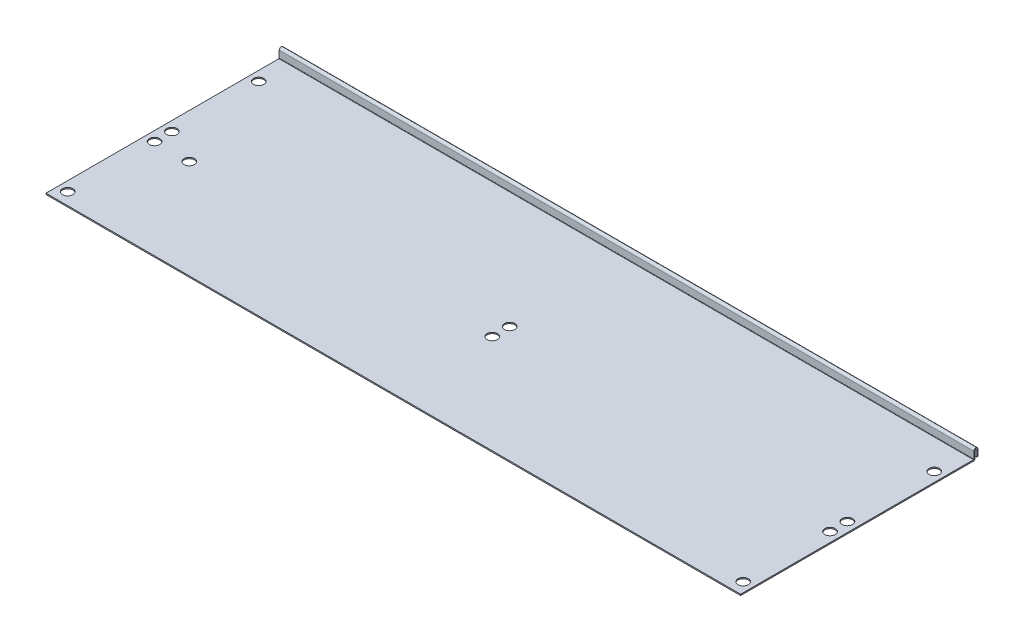
ISO-10303-21;
HEADER;
FILE_DESCRIPTION(('STEP AP214'),'2;1');
FILE_NAME('part.step','',(''),(''),'','','');
FILE_SCHEMA(('AUTOMOTIVE_DESIGN { 1 0 10303 214 1 1 1 1 }'));
ENDSEC;
DATA;
#1=APPLICATION_CONTEXT('core data for automotive mechanical design processes');
#2=APPLICATION_PROTOCOL_DEFINITION('international standard','automotive_design',2000,#1);
#3=PRODUCT_CONTEXT('',#1,'mechanical');
#4=PRODUCT('Part','Part','',(#3));
#5=PRODUCT_RELATED_PRODUCT_CATEGORY('part','',(#4));
#6=PRODUCT_DEFINITION_FORMATION('','',#4);
#7=PRODUCT_DEFINITION_CONTEXT('part definition',#1,'design');
#8=PRODUCT_DEFINITION('design','',#6,#7);
#9=PRODUCT_DEFINITION_SHAPE('','',#8);
#10=(LENGTH_UNIT() NAMED_UNIT(*) SI_UNIT(.MILLI.,.METRE.));
#11=(NAMED_UNIT(*) PLANE_ANGLE_UNIT() SI_UNIT($,.RADIAN.));
#12=(NAMED_UNIT(*) SI_UNIT($,.STERADIAN.) SOLID_ANGLE_UNIT());
#13=UNCERTAINTY_MEASURE_WITH_UNIT(LENGTH_MEASURE(1.E-05),#10,'distance_accuracy_value','');
#14=(GEOMETRIC_REPRESENTATION_CONTEXT(3) GLOBAL_UNCERTAINTY_ASSIGNED_CONTEXT((#13)) GLOBAL_UNIT_ASSIGNED_CONTEXT((#10,
#11,#12)) REPRESENTATION_CONTEXT('',''));
#15=CARTESIAN_POINT('',(0.,0.,0.));
#16=DIRECTION('',(0.,0.,1.));
#17=DIRECTION('',(1.,0.,0.));
#18=AXIS2_PLACEMENT_3D('',#15,#16,#17);
#19=CARTESIAN_POINT('',(200.,-0.7,-67.5));
#20=DIRECTION('',(1.,0.,0.));
#21=DIRECTION('',(0.,0.,-1.));
#22=AXIS2_PLACEMENT_3D('',#19,#20,#21);
#23=PLANE('',#22);
#24=DIRECTION('',(0.,0.,-1.));
#25=VECTOR('',#24,1.);
#26=CARTESIAN_POINT('',(200.,-0.7,-67.5));
#27=LINE('',#26,#25);
#28=CARTESIAN_POINT('',(200.,-0.7,67.5));
#29=VERTEX_POINT('',#28);
#30=CARTESIAN_POINT('',(200.,-0.699999999999992,-66.6));
#31=VERTEX_POINT('',#30);
#32=EDGE_CURVE('E289',#29,#31,#27,.T.);
#33=ORIENTED_EDGE('',*,*,#32,.F.);
#34=DIRECTION('',(0.,-1.,0.));
#35=VECTOR('',#34,1.);
#36=CARTESIAN_POINT('',(200.,-0.7,67.5));
#37=LINE('',#36,#35);
#38=CARTESIAN_POINT('',(200.,-1.4,67.5));
#39=VERTEX_POINT('',#38);
#40=EDGE_CURVE('E13',#29,#39,#37,.T.);
#41=ORIENTED_EDGE('',*,*,#40,.T.);
#42=DIRECTION('',(0.,0.,-1.));
#43=VECTOR('',#42,1.);
#44=CARTESIAN_POINT('',(200.,-1.4,-67.5));
#45=LINE('',#44,#43);
#46=CARTESIAN_POINT('',(200.,-1.39999999999999,-66.6));
#47=VERTEX_POINT('',#46);
#48=EDGE_CURVE('E286',#39,#47,#45,.T.);
#49=ORIENTED_EDGE('',*,*,#48,.T.);
#50=DIRECTION('',(0.,-1.,0.));
#51=VECTOR('',#50,1.);
#52=CARTESIAN_POINT('',(200.,-0.699999999999992,-66.6));
#53=LINE('',#52,#51);
#54=EDGE_CURVE('E208',#31,#47,#53,.T.);
#55=ORIENTED_EDGE('',*,*,#54,.F.);
#56=EDGE_LOOP('',(#33,#41,#49,#55));
#57=FACE_BOUND('',#56,.T.);
#58=ADVANCED_FACE('F58',(#57),#23,.T.);
#59=CARTESIAN_POINT('',(0.,-0.7,0.));
#60=DIRECTION('',(0.,-1.,0.));
#61=DIRECTION('',(0.,0.,1.));
#62=AXIS2_PLACEMENT_3D('',#59,#60,#61);
#63=PLANE('',#62);
#64=CARTESIAN_POINT('',(-194.5,-0.7,60.5));
#65=DIRECTION('',(0.,1.,0.));
#66=DIRECTION('',(0.,0.,1.));
#67=AXIS2_PLACEMENT_3D('',#64,#65,#66);
#68=CIRCLE('',#67,2.99999999999999);
#69=CARTESIAN_POINT('',(-194.5,-0.7,63.5));
#70=VERTEX_POINT('',#69);
#71=EDGE_CURVE('E283',#70,#70,#68,.T.);
#72=ORIENTED_EDGE('',*,*,#71,.F.);
#73=EDGE_LOOP('',(#72));
#74=FACE_BOUND('',#73,.T.);
#75=CARTESIAN_POINT('',(-194.5,-0.7,10.5));
#76=DIRECTION('',(0.,1.,0.));
#77=DIRECTION('',(0.,0.,1.));
#78=AXIS2_PLACEMENT_3D('',#75,#76,#77);
#79=CIRCLE('',#78,2.99999999999999);
#80=CARTESIAN_POINT('',(-194.5,-0.7,13.5));
#81=VERTEX_POINT('',#80);
#82=EDGE_CURVE('E277',#81,#81,#79,.T.);
#83=ORIENTED_EDGE('',*,*,#82,.F.);
#84=EDGE_LOOP('',(#83));
#85=FACE_BOUND('',#84,.T.);
#86=CARTESIAN_POINT('',(-194.5,-0.7,0.500000000000002));
#87=DIRECTION('',(0.,1.,0.));
#88=DIRECTION('',(0.,0.,1.));
#89=AXIS2_PLACEMENT_3D('',#86,#87,#88);
#90=CIRCLE('',#89,2.99999999999999);
#91=CARTESIAN_POINT('',(-194.5,-0.7,3.5));
#92=VERTEX_POINT('',#91);
#93=EDGE_CURVE('E271',#92,#92,#90,.T.);
#94=ORIENTED_EDGE('',*,*,#93,.F.);
#95=EDGE_LOOP('',(#94));
#96=FACE_BOUND('',#95,.T.);
#97=CARTESIAN_POINT('',(-194.5,-0.7,-49.5));
#98=DIRECTION('',(0.,1.,0.));
#99=DIRECTION('',(0.,0.,1.));
#100=AXIS2_PLACEMENT_3D('',#97,#98,#99);
#101=CIRCLE('',#100,2.99999999999999);
#102=CARTESIAN_POINT('',(-194.5,-0.7,-46.5));
#103=VERTEX_POINT('',#102);
#104=EDGE_CURVE('E265',#103,#103,#101,.T.);
#105=ORIENTED_EDGE('',*,*,#104,.F.);
#106=EDGE_LOOP('',(#105));
#107=FACE_BOUND('',#106,.T.);
#108=CARTESIAN_POINT('',(194.5,-0.7,60.5));
#109=DIRECTION('',(0.,1.,0.));
#110=DIRECTION('',(0.,0.,-1.));
#111=AXIS2_PLACEMENT_3D('',#108,#109,#110);
#112=CIRCLE('',#111,2.99999999999999);
#113=CARTESIAN_POINT('',(194.5,-0.7,57.5));
#114=VERTEX_POINT('',#113);
#115=EDGE_CURVE('E259',#114,#114,#112,.T.);
#116=ORIENTED_EDGE('',*,*,#115,.F.);
#117=EDGE_LOOP('',(#116));
#118=FACE_BOUND('',#117,.T.);
#119=CARTESIAN_POINT('',(194.5,-0.7,10.5));
#120=DIRECTION('',(0.,1.,0.));
#121=DIRECTION('',(0.,0.,-1.));
#122=AXIS2_PLACEMENT_3D('',#119,#120,#121);
#123=CIRCLE('',#122,2.99999999999999);
#124=CARTESIAN_POINT('',(194.5,-0.7,7.49999999999996));
#125=VERTEX_POINT('',#124);
#126=EDGE_CURVE('E253',#125,#125,#123,.T.);
#127=ORIENTED_EDGE('',*,*,#126,.F.);
#128=EDGE_LOOP('',(#127));
#129=FACE_BOUND('',#128,.T.);
#130=CARTESIAN_POINT('',(194.5,-0.7,0.499999999999955));
#131=DIRECTION('',(0.,1.,0.));
#132=DIRECTION('',(0.,0.,-1.));
#133=AXIS2_PLACEMENT_3D('',#130,#131,#132);
#134=CIRCLE('',#133,2.99999999999999);
#135=CARTESIAN_POINT('',(194.5,-0.7,-2.50000000000004));
#136=VERTEX_POINT('',#135);
#137=EDGE_CURVE('E247',#136,#136,#134,.T.);
#138=ORIENTED_EDGE('',*,*,#137,.F.);
#139=EDGE_LOOP('',(#138));
#140=FACE_BOUND('',#139,.T.);
#141=CARTESIAN_POINT('',(194.5,-0.7,-49.5));
#142=DIRECTION('',(0.,1.,0.));
#143=DIRECTION('',(0.,0.,-1.));
#144=AXIS2_PLACEMENT_3D('',#141,#142,#143);
#145=CIRCLE('',#144,2.99999999999999);
#146=CARTESIAN_POINT('',(194.5,-0.7,-52.5));
#147=VERTEX_POINT('',#146);
#148=EDGE_CURVE('E241',#147,#147,#145,.T.);
#149=ORIENTED_EDGE('',*,*,#148,.F.);
#150=EDGE_LOOP('',(#149));
#151=FACE_BOUND('',#150,.T.);
#152=CARTESIAN_POINT('',(0.,-0.7,10.5));
#153=DIRECTION('',(0.,1.,0.));
#154=DIRECTION('',(0.,0.,1.));
#155=AXIS2_PLACEMENT_3D('',#152,#153,#154);
#156=CIRCLE('',#155,3.);
#157=CARTESIAN_POINT('',(0.,-0.7,13.5));
#158=VERTEX_POINT('',#157);
#159=EDGE_CURVE('E235',#158,#158,#156,.T.);
#160=ORIENTED_EDGE('',*,*,#159,.F.);
#161=EDGE_LOOP('',(#160));
#162=FACE_BOUND('',#161,.T.);
#163=CARTESIAN_POINT('',(0.,-0.7,0.500000000000002));
#164=DIRECTION('',(0.,1.,0.));
#165=DIRECTION('',(0.,0.,1.));
#166=AXIS2_PLACEMENT_3D('',#163,#164,#165);
#167=CIRCLE('',#166,3.);
#168=CARTESIAN_POINT('',(0.,-0.7,3.5));
#169=VERTEX_POINT('',#168);
#170=EDGE_CURVE('E229',#169,#169,#167,.T.);
#171=ORIENTED_EDGE('',*,*,#170,.F.);
#172=EDGE_LOOP('',(#171));
#173=FACE_BOUND('',#172,.T.);
#174=CARTESIAN_POINT('',(-174.5,-0.7,10.5));
#175=DIRECTION('',(0.,1.,0.));
#176=DIRECTION('',(0.,0.,1.));
#177=AXIS2_PLACEMENT_3D('',#174,#175,#176);
#178=CIRCLE('',#177,2.99999999999999);
#179=CARTESIAN_POINT('',(-174.5,-0.7,13.5));
#180=VERTEX_POINT('',#179);
#181=EDGE_CURVE('E223',#180,#180,#178,.T.);
#182=ORIENTED_EDGE('',*,*,#181,.F.);
#183=EDGE_LOOP('',(#182));
#184=FACE_BOUND('',#183,.T.);
#185=DIRECTION('',(1.,0.,0.));
#186=VECTOR('',#185,1.);
#187=CARTESIAN_POINT('',(200.,-0.699999999999992,-66.6));
#188=LINE('',#187,#186);
#189=CARTESIAN_POINT('',(-200.,-0.699999999999992,-66.6));
#190=VERTEX_POINT('',#189);
#191=EDGE_CURVE('E213',#31,#190,#188,.F.);
#192=ORIENTED_EDGE('',*,*,#191,.T.);
#193=DIRECTION('',(0.,0.,1.));
#194=VECTOR('',#193,1.);
#195=CARTESIAN_POINT('',(-200.,-0.7,-67.5));
#196=LINE('',#195,#194);
#197=CARTESIAN_POINT('',(-200.,-0.7,67.5));
#198=VERTEX_POINT('',#197);
#199=EDGE_CURVE('E292',#190,#198,#196,.T.);
#200=ORIENTED_EDGE('',*,*,#199,.T.);
#201=DIRECTION('',(1.,0.,0.));
#202=VECTOR('',#201,1.);
#203=CARTESIAN_POINT('',(-200.,-0.7,67.5));
#204=LINE('',#203,#202);
#205=EDGE_CURVE('E296',#198,#29,#204,.T.);
#206=ORIENTED_EDGE('',*,*,#205,.T.);
#207=ORIENTED_EDGE('',*,*,#32,.T.);
#208=EDGE_LOOP('',(#192,#200,#206,#207));
#209=FACE_BOUND('',#208,.T.);
#210=ADVANCED_FACE('F317',(#74,#85,#96,#107,#118,#129,#140,#151,#162,#173,#184,#209),#63,.F.);
#211=CARTESIAN_POINT('',(0.,-1.4,0.));
#212=DIRECTION('',(0.,-1.,0.));
#213=DIRECTION('',(0.,0.,1.));
#214=AXIS2_PLACEMENT_3D('',#211,#212,#213);
#215=PLANE('',#214);
#216=CARTESIAN_POINT('',(-174.5,-1.4,10.5));
#217=DIRECTION('',(0.,1.,0.));
#218=DIRECTION('',(0.,0.,1.));
#219=AXIS2_PLACEMENT_3D('',#216,#217,#218);
#220=CIRCLE('',#219,2.99999999999999);
#221=CARTESIAN_POINT('',(-174.5,-1.4,13.5));
#222=VERTEX_POINT('',#221);
#223=EDGE_CURVE('E220',#222,#222,#220,.T.);
#224=ORIENTED_EDGE('',*,*,#223,.T.);
#225=EDGE_LOOP('',(#224));
#226=FACE_BOUND('',#225,.T.);
#227=CARTESIAN_POINT('',(0.,-1.4,0.500000000000002));
#228=DIRECTION('',(0.,1.,0.));
#229=DIRECTION('',(0.,0.,1.));
#230=AXIS2_PLACEMENT_3D('',#227,#228,#229);
#231=CIRCLE('',#230,3.);
#232=CARTESIAN_POINT('',(0.,-1.4,3.5));
#233=VERTEX_POINT('',#232);
#234=EDGE_CURVE('E226',#233,#233,#231,.T.);
#235=ORIENTED_EDGE('',*,*,#234,.T.);
#236=EDGE_LOOP('',(#235));
#237=FACE_BOUND('',#236,.T.);
#238=CARTESIAN_POINT('',(0.,-1.4,10.5));
#239=DIRECTION('',(0.,1.,0.));
#240=DIRECTION('',(0.,0.,1.));
#241=AXIS2_PLACEMENT_3D('',#238,#239,#240);
#242=CIRCLE('',#241,3.);
#243=CARTESIAN_POINT('',(0.,-1.4,13.5));
#244=VERTEX_POINT('',#243);
#245=EDGE_CURVE('E232',#244,#244,#242,.T.);
#246=ORIENTED_EDGE('',*,*,#245,.T.);
#247=EDGE_LOOP('',(#246));
#248=FACE_BOUND('',#247,.T.);
#249=CARTESIAN_POINT('',(194.5,-1.4,-49.5));
#250=DIRECTION('',(0.,1.,0.));
#251=DIRECTION('',(0.,0.,-1.));
#252=AXIS2_PLACEMENT_3D('',#249,#250,#251);
#253=CIRCLE('',#252,2.99999999999999);
#254=CARTESIAN_POINT('',(194.5,-1.4,-52.5));
#255=VERTEX_POINT('',#254);
#256=EDGE_CURVE('E238',#255,#255,#253,.T.);
#257=ORIENTED_EDGE('',*,*,#256,.T.);
#258=EDGE_LOOP('',(#257));
#259=FACE_BOUND('',#258,.T.);
#260=CARTESIAN_POINT('',(194.5,-1.4,0.499999999999955));
#261=DIRECTION('',(0.,1.,0.));
#262=DIRECTION('',(0.,0.,-1.));
#263=AXIS2_PLACEMENT_3D('',#260,#261,#262);
#264=CIRCLE('',#263,2.99999999999999);
#265=CARTESIAN_POINT('',(194.5,-1.4,-2.50000000000004));
#266=VERTEX_POINT('',#265);
#267=EDGE_CURVE('E244',#266,#266,#264,.T.);
#268=ORIENTED_EDGE('',*,*,#267,.T.);
#269=EDGE_LOOP('',(#268));
#270=FACE_BOUND('',#269,.T.);
#271=CARTESIAN_POINT('',(194.5,-1.4,10.5));
#272=DIRECTION('',(0.,1.,0.));
#273=DIRECTION('',(0.,0.,-1.));
#274=AXIS2_PLACEMENT_3D('',#271,#272,#273);
#275=CIRCLE('',#274,2.99999999999999);
#276=CARTESIAN_POINT('',(194.5,-1.4,7.49999999999996));
#277=VERTEX_POINT('',#276);
#278=EDGE_CURVE('E250',#277,#277,#275,.T.);
#279=ORIENTED_EDGE('',*,*,#278,.T.);
#280=EDGE_LOOP('',(#279));
#281=FACE_BOUND('',#280,.T.);
#282=CARTESIAN_POINT('',(194.5,-1.4,60.5));
#283=DIRECTION('',(0.,1.,0.));
#284=DIRECTION('',(0.,0.,-1.));
#285=AXIS2_PLACEMENT_3D('',#282,#283,#284);
#286=CIRCLE('',#285,2.99999999999999);
#287=CARTESIAN_POINT('',(194.5,-1.4,57.5));
#288=VERTEX_POINT('',#287);
#289=EDGE_CURVE('E256',#288,#288,#286,.T.);
#290=ORIENTED_EDGE('',*,*,#289,.T.);
#291=EDGE_LOOP('',(#290));
#292=FACE_BOUND('',#291,.T.);
#293=CARTESIAN_POINT('',(-194.5,-1.4,-49.5));
#294=DIRECTION('',(0.,1.,0.));
#295=DIRECTION('',(0.,0.,1.));
#296=AXIS2_PLACEMENT_3D('',#293,#294,#295);
#297=CIRCLE('',#296,2.99999999999999);
#298=CARTESIAN_POINT('',(-194.5,-1.4,-46.5));
#299=VERTEX_POINT('',#298);
#300=EDGE_CURVE('E262',#299,#299,#297,.T.);
#301=ORIENTED_EDGE('',*,*,#300,.T.);
#302=EDGE_LOOP('',(#301));
#303=FACE_BOUND('',#302,.T.);
#304=CARTESIAN_POINT('',(-194.5,-1.4,0.500000000000002));
#305=DIRECTION('',(0.,1.,0.));
#306=DIRECTION('',(0.,0.,1.));
#307=AXIS2_PLACEMENT_3D('',#304,#305,#306);
#308=CIRCLE('',#307,2.99999999999999);
#309=CARTESIAN_POINT('',(-194.5,-1.4,3.5));
#310=VERTEX_POINT('',#309);
#311=EDGE_CURVE('E268',#310,#310,#308,.T.);
#312=ORIENTED_EDGE('',*,*,#311,.T.);
#313=EDGE_LOOP('',(#312));
#314=FACE_BOUND('',#313,.T.);
#315=CARTESIAN_POINT('',(-194.5,-1.4,10.5));
#316=DIRECTION('',(0.,1.,0.));
#317=DIRECTION('',(0.,0.,1.));
#318=AXIS2_PLACEMENT_3D('',#315,#316,#317);
#319=CIRCLE('',#318,2.99999999999999);
#320=CARTESIAN_POINT('',(-194.5,-1.4,13.5));
#321=VERTEX_POINT('',#320);
#322=EDGE_CURVE('E274',#321,#321,#319,.T.);
#323=ORIENTED_EDGE('',*,*,#322,.T.);
#324=EDGE_LOOP('',(#323));
#325=FACE_BOUND('',#324,.T.);
#326=CARTESIAN_POINT('',(-194.5,-1.4,60.5));
#327=DIRECTION('',(0.,1.,0.));
#328=DIRECTION('',(0.,0.,1.));
#329=AXIS2_PLACEMENT_3D('',#326,#327,#328);
#330=CIRCLE('',#329,2.99999999999999);
#331=CARTESIAN_POINT('',(-194.5,-1.4,63.5));
#332=VERTEX_POINT('',#331);
#333=EDGE_CURVE('E280',#332,#332,#330,.T.);
#334=ORIENTED_EDGE('',*,*,#333,.T.);
#335=EDGE_LOOP('',(#334));
#336=FACE_BOUND('',#335,.T.);
#337=ORIENTED_EDGE('',*,*,#48,.F.);
#338=DIRECTION('',(1.,0.,0.));
#339=VECTOR('',#338,1.);
#340=CARTESIAN_POINT('',(-200.,-1.4,67.5));
#341=LINE('',#340,#339);
#342=CARTESIAN_POINT('',(-200.,-1.4,67.5));
#343=VERTEX_POINT('',#342);
#344=EDGE_CURVE('E293',#343,#39,#341,.T.);
#345=ORIENTED_EDGE('',*,*,#344,.F.);
#346=DIRECTION('',(0.,0.,1.));
#347=VECTOR('',#346,1.);
#348=CARTESIAN_POINT('',(-200.,-1.4,-67.5));
#349=LINE('',#348,#347);
#350=CARTESIAN_POINT('',(-200.,-1.4,-66.6));
#351=VERTEX_POINT('',#350);
#352=EDGE_CURVE('E300',#351,#343,#349,.T.);
#353=ORIENTED_EDGE('',*,*,#352,.F.);
#354=DIRECTION('',(1.,0.,0.));
#355=VECTOR('',#354,1.);
#356=CARTESIAN_POINT('',(200.,-1.39999999999999,-66.6));
#357=LINE('',#356,#355);
#358=EDGE_CURVE('E203',#47,#351,#357,.F.);
#359=ORIENTED_EDGE('',*,*,#358,.F.);
#360=EDGE_LOOP('',(#337,#345,#353,#359));
#361=FACE_BOUND('',#360,.T.);
#362=ADVANCED_FACE('F313',(#226,#237,#248,#259,#270,#281,#292,#303,#314,#325,#336,#361),#215,.T.);
#363=CARTESIAN_POINT('',(-200.,-0.7,67.5));
#364=DIRECTION('',(0.,0.,1.));
#365=DIRECTION('',(1.,0.,0.));
#366=AXIS2_PLACEMENT_3D('',#363,#364,#365);
#367=PLANE('',#366);
#368=ORIENTED_EDGE('',*,*,#344,.T.);
#369=ORIENTED_EDGE('',*,*,#40,.F.);
#370=ORIENTED_EDGE('',*,*,#205,.F.);
#371=DIRECTION('',(0.,-1.,0.));
#372=VECTOR('',#371,1.);
#373=CARTESIAN_POINT('',(-200.,-0.7,67.5));
#374=LINE('',#373,#372);
#375=EDGE_CURVE('E61',#198,#343,#374,.T.);
#376=ORIENTED_EDGE('',*,*,#375,.T.);
#377=EDGE_LOOP('',(#368,#369,#370,#376));
#378=FACE_BOUND('',#377,.T.);
#379=ADVANCED_FACE('F307',(#378),#367,.T.);
#380=CARTESIAN_POINT('',(-200.,-0.7,-67.5));
#381=DIRECTION('',(-1.,0.,0.));
#382=DIRECTION('',(0.,0.,1.));
#383=AXIS2_PLACEMENT_3D('',#380,#381,#382);
#384=PLANE('',#383);
#385=DIRECTION('',(0.,-1.,0.));
#386=VECTOR('',#385,1.);
#387=CARTESIAN_POINT('',(-200.,-0.699999999999992,-66.6));
#388=LINE('',#387,#386);
#389=EDGE_CURVE('E218',#190,#351,#388,.T.);
#390=ORIENTED_EDGE('',*,*,#389,.T.);
#391=ORIENTED_EDGE('',*,*,#352,.T.);
#392=ORIENTED_EDGE('',*,*,#375,.F.);
#393=ORIENTED_EDGE('',*,*,#199,.F.);
#394=EDGE_LOOP('',(#390,#391,#392,#393));
#395=FACE_BOUND('',#394,.T.);
#396=ADVANCED_FACE('F321',(#395),#384,.T.);
#397=CARTESIAN_POINT('',(-194.5,-0.7,60.5));
#398=DIRECTION('',(0.,-1.,0.));
#399=DIRECTION('',(0.,0.,1.));
#400=AXIS2_PLACEMENT_3D('',#397,#398,#399);
#401=CYLINDRICAL_SURFACE('',#400,2.99999999999999);
#402=ORIENTED_EDGE('',*,*,#71,.T.);
#403=EDGE_LOOP('',(#402));
#404=FACE_BOUND('',#403,.T.);
#405=ORIENTED_EDGE('',*,*,#333,.F.);
#406=EDGE_LOOP('',(#405));
#407=FACE_BOUND('',#406,.T.);
#408=ADVANCED_FACE('F359',(#404,#407),#401,.F.);
#409=CARTESIAN_POINT('',(-194.5,-0.7,10.5));
#410=DIRECTION('',(0.,-1.,0.));
#411=DIRECTION('',(0.,0.,1.));
#412=AXIS2_PLACEMENT_3D('',#409,#410,#411);
#413=CYLINDRICAL_SURFACE('',#412,2.99999999999999);
#414=ORIENTED_EDGE('',*,*,#82,.T.);
#415=EDGE_LOOP('',(#414));
#416=FACE_BOUND('',#415,.T.);
#417=ORIENTED_EDGE('',*,*,#322,.F.);
#418=EDGE_LOOP('',(#417));
#419=FACE_BOUND('',#418,.T.);
#420=ADVANCED_FACE('F367',(#416,#419),#413,.F.);
#421=CARTESIAN_POINT('',(-194.5,-0.7,0.500000000000002));
#422=DIRECTION('',(0.,-1.,0.));
#423=DIRECTION('',(0.,0.,1.));
#424=AXIS2_PLACEMENT_3D('',#421,#422,#423);
#425=CYLINDRICAL_SURFACE('',#424,2.99999999999999);
#426=ORIENTED_EDGE('',*,*,#93,.T.);
#427=EDGE_LOOP('',(#426));
#428=FACE_BOUND('',#427,.T.);
#429=ORIENTED_EDGE('',*,*,#311,.F.);
#430=EDGE_LOOP('',(#429));
#431=FACE_BOUND('',#430,.T.);
#432=ADVANCED_FACE('F372',(#428,#431),#425,.F.);
#433=CARTESIAN_POINT('',(-194.5,-0.7,-49.5));
#434=DIRECTION('',(0.,-1.,0.));
#435=DIRECTION('',(0.,0.,1.));
#436=AXIS2_PLACEMENT_3D('',#433,#434,#435);
#437=CYLINDRICAL_SURFACE('',#436,2.99999999999999);
#438=ORIENTED_EDGE('',*,*,#104,.T.);
#439=EDGE_LOOP('',(#438));
#440=FACE_BOUND('',#439,.T.);
#441=ORIENTED_EDGE('',*,*,#300,.F.);
#442=EDGE_LOOP('',(#441));
#443=FACE_BOUND('',#442,.T.);
#444=ADVANCED_FACE('F380',(#440,#443),#437,.F.);
#445=CARTESIAN_POINT('',(194.5,-0.7,60.5));
#446=DIRECTION('',(0.,-1.,0.));
#447=DIRECTION('',(0.,0.,1.));
#448=AXIS2_PLACEMENT_3D('',#445,#446,#447);
#449=CYLINDRICAL_SURFACE('',#448,2.99999999999999);
#450=ORIENTED_EDGE('',*,*,#115,.T.);
#451=EDGE_LOOP('',(#450));
#452=FACE_BOUND('',#451,.T.);
#453=ORIENTED_EDGE('',*,*,#289,.F.);
#454=EDGE_LOOP('',(#453));
#455=FACE_BOUND('',#454,.T.);
#456=ADVANCED_FACE('F387',(#452,#455),#449,.F.);
#457=CARTESIAN_POINT('',(194.5,-0.7,10.5));
#458=DIRECTION('',(0.,-1.,0.));
#459=DIRECTION('',(0.,0.,1.));
#460=AXIS2_PLACEMENT_3D('',#457,#458,#459);
#461=CYLINDRICAL_SURFACE('',#460,2.99999999999999);
#462=ORIENTED_EDGE('',*,*,#126,.T.);
#463=EDGE_LOOP('',(#462));
#464=FACE_BOUND('',#463,.T.);
#465=ORIENTED_EDGE('',*,*,#278,.F.);
#466=EDGE_LOOP('',(#465));
#467=FACE_BOUND('',#466,.T.);
#468=ADVANCED_FACE('F391',(#464,#467),#461,.F.);
#469=CARTESIAN_POINT('',(194.5,-0.7,0.499999999999955));
#470=DIRECTION('',(0.,-1.,0.));
#471=DIRECTION('',(0.,0.,1.));
#472=AXIS2_PLACEMENT_3D('',#469,#470,#471);
#473=CYLINDRICAL_SURFACE('',#472,2.99999999999999);
#474=ORIENTED_EDGE('',*,*,#137,.T.);
#475=EDGE_LOOP('',(#474));
#476=FACE_BOUND('',#475,.T.);
#477=ORIENTED_EDGE('',*,*,#267,.F.);
#478=EDGE_LOOP('',(#477));
#479=FACE_BOUND('',#478,.T.);
#480=ADVANCED_FACE('F395',(#476,#479),#473,.F.);
#481=CARTESIAN_POINT('',(194.5,-0.7,-49.5));
#482=DIRECTION('',(0.,-1.,0.));
#483=DIRECTION('',(0.,0.,1.));
#484=AXIS2_PLACEMENT_3D('',#481,#482,#483);
#485=CYLINDRICAL_SURFACE('',#484,2.99999999999999);
#486=ORIENTED_EDGE('',*,*,#148,.T.);
#487=EDGE_LOOP('',(#486));
#488=FACE_BOUND('',#487,.T.);
#489=ORIENTED_EDGE('',*,*,#256,.F.);
#490=EDGE_LOOP('',(#489));
#491=FACE_BOUND('',#490,.T.);
#492=ADVANCED_FACE('F399',(#488,#491),#485,.F.);
#493=CARTESIAN_POINT('',(0.,-0.7,10.5));
#494=DIRECTION('',(0.,-1.,0.));
#495=DIRECTION('',(0.,0.,1.));
#496=AXIS2_PLACEMENT_3D('',#493,#494,#495);
#497=CYLINDRICAL_SURFACE('',#496,3.);
#498=ORIENTED_EDGE('',*,*,#159,.T.);
#499=EDGE_LOOP('',(#498));
#500=FACE_BOUND('',#499,.T.);
#501=ORIENTED_EDGE('',*,*,#245,.F.);
#502=EDGE_LOOP('',(#501));
#503=FACE_BOUND('',#502,.T.);
#504=ADVANCED_FACE('F403',(#500,#503),#497,.F.);
#505=CARTESIAN_POINT('',(0.,-0.7,0.500000000000002));
#506=DIRECTION('',(0.,-1.,0.));
#507=DIRECTION('',(0.,0.,1.));
#508=AXIS2_PLACEMENT_3D('',#505,#506,#507);
#509=CYLINDRICAL_SURFACE('',#508,3.);
#510=ORIENTED_EDGE('',*,*,#170,.T.);
#511=EDGE_LOOP('',(#510));
#512=FACE_BOUND('',#511,.T.);
#513=ORIENTED_EDGE('',*,*,#234,.F.);
#514=EDGE_LOOP('',(#513));
#515=FACE_BOUND('',#514,.T.);
#516=ADVANCED_FACE('F341',(#512,#515),#509,.F.);
#517=CARTESIAN_POINT('',(-174.5,-0.7,10.5));
#518=DIRECTION('',(0.,-1.,0.));
#519=DIRECTION('',(0.,0.,1.));
#520=AXIS2_PLACEMENT_3D('',#517,#518,#519);
#521=CYLINDRICAL_SURFACE('',#520,2.99999999999999);
#522=ORIENTED_EDGE('',*,*,#181,.T.);
#523=EDGE_LOOP('',(#522));
#524=FACE_BOUND('',#523,.T.);
#525=ORIENTED_EDGE('',*,*,#223,.F.);
#526=EDGE_LOOP('',(#525));
#527=FACE_BOUND('',#526,.T.);
#528=ADVANCED_FACE('F334',(#524,#527),#521,.F.);
#529=CARTESIAN_POINT('',(-200.,-0.499999999999987,-66.6));
#530=DIRECTION('',(-1.,0.,0.));
#531=DIRECTION('',(0.,0.,1.));
#532=AXIS2_PLACEMENT_3D('',#529,#530,#531);
#533=PLANE('',#532);
#534=DIRECTION('',(0.,0.,1.));
#535=VECTOR('',#534,1.);
#536=CARTESIAN_POINT('',(-200.,-0.499999999999993,-67.5));
#537=LINE('',#536,#535);
#538=CARTESIAN_POINT('',(-200.,-0.499999999999987,-66.8));
#539=VERTEX_POINT('',#538);
#540=CARTESIAN_POINT('',(-200.,-0.499999999999989,-67.5));
#541=VERTEX_POINT('',#540);
#542=EDGE_CURVE('E184',#539,#541,#537,.F.);
#543=ORIENTED_EDGE('',*,*,#542,.T.);
#544=CARTESIAN_POINT('',(-200.,-0.499999999999987,-66.6));
#545=DIRECTION('',(-1.,0.,0.));
#546=DIRECTION('',(0.,0.,-1.));
#547=AXIS2_PLACEMENT_3D('',#544,#545,#546);
#548=CIRCLE('',#547,0.900000000000006);
#549=EDGE_CURVE('E80',#351,#541,#548,.F.);
#550=ORIENTED_EDGE('',*,*,#549,.F.);
#551=ORIENTED_EDGE('',*,*,#389,.F.);
#552=CARTESIAN_POINT('',(-200.,-0.499999999999987,-66.6));
#553=DIRECTION('',(-1.,0.,0.));
#554=DIRECTION('',(0.,0.,-1.));
#555=AXIS2_PLACEMENT_3D('',#552,#553,#554);
#556=CIRCLE('',#555,0.200000000000006);
#557=EDGE_CURVE('E210',#190,#539,#556,.F.);
#558=ORIENTED_EDGE('',*,*,#557,.T.);
#559=EDGE_LOOP('',(#543,#550,#551,#558));
#560=FACE_BOUND('',#559,.T.);
#561=ADVANCED_FACE('F332',(#560),#533,.T.);
#562=CARTESIAN_POINT('',(200.,-0.499999999999987,-66.6));
#563=DIRECTION('',(-1.,0.,0.));
#564=DIRECTION('',(0.,0.,1.));
#565=AXIS2_PLACEMENT_3D('',#562,#563,#564);
#566=PLANE('',#565);
#567=CARTESIAN_POINT('',(200.,-0.499999999999987,-66.6));
#568=DIRECTION('',(-1.,0.,0.));
#569=DIRECTION('',(0.,0.,-1.));
#570=AXIS2_PLACEMENT_3D('',#567,#568,#569);
#571=CIRCLE('',#570,0.200000000000006);
#572=CARTESIAN_POINT('',(200.,-0.499999999999987,-66.8));
#573=VERTEX_POINT('',#572);
#574=EDGE_CURVE('E216',#573,#31,#571,.T.);
#575=ORIENTED_EDGE('',*,*,#574,.T.);
#576=ORIENTED_EDGE('',*,*,#54,.T.);
#577=CARTESIAN_POINT('',(200.,-0.499999999999987,-66.6));
#578=DIRECTION('',(-1.,0.,0.));
#579=DIRECTION('',(0.,0.,-1.));
#580=AXIS2_PLACEMENT_3D('',#577,#578,#579);
#581=CIRCLE('',#580,0.900000000000006);
#582=CARTESIAN_POINT('',(200.,-0.499999999999993,-67.5));
#583=VERTEX_POINT('',#582);
#584=EDGE_CURVE('E206',#583,#47,#581,.T.);
#585=ORIENTED_EDGE('',*,*,#584,.F.);
#586=DIRECTION('',(0.,0.,1.));
#587=VECTOR('',#586,1.);
#588=CARTESIAN_POINT('',(200.,-0.499999999999988,-66.8));
#589=LINE('',#588,#587);
#590=EDGE_CURVE('E196',#573,#583,#589,.F.);
#591=ORIENTED_EDGE('',*,*,#590,.F.);
#592=EDGE_LOOP('',(#575,#576,#585,#591));
#593=FACE_BOUND('',#592,.T.);
#594=ADVANCED_FACE('F328',(#593),#566,.F.);
#595=CARTESIAN_POINT('',(200.,-0.499999999999987,-66.6));
#596=DIRECTION('',(1.,0.,0.));
#597=DIRECTION('',(0.,0.,-1.));
#598=AXIS2_PLACEMENT_3D('',#595,#596,#597);
#599=CYLINDRICAL_SURFACE('',#598,0.900000000000006);
#600=ORIENTED_EDGE('',*,*,#358,.T.);
#601=ORIENTED_EDGE('',*,*,#549,.T.);
#602=DIRECTION('',(1.,0.,0.));
#603=VECTOR('',#602,1.);
#604=CARTESIAN_POINT('',(-200.,-0.499999999999993,-67.5));
#605=LINE('',#604,#603);
#606=EDGE_CURVE('E190',#583,#541,#605,.F.);
#607=ORIENTED_EDGE('',*,*,#606,.F.);
#608=ORIENTED_EDGE('',*,*,#584,.T.);
#609=EDGE_LOOP('',(#600,#601,#607,#608));
#610=FACE_BOUND('',#609,.T.);
#611=ADVANCED_FACE('F323',(#610),#599,.T.);
#612=CARTESIAN_POINT('',(200.,-0.499999999999987,-66.6));
#613=DIRECTION('',(1.,0.,0.));
#614=DIRECTION('',(0.,0.,-1.));
#615=AXIS2_PLACEMENT_3D('',#612,#613,#614);
#616=CYLINDRICAL_SURFACE('',#615,0.200000000000006);
#617=ORIENTED_EDGE('',*,*,#191,.F.);
#618=ORIENTED_EDGE('',*,*,#574,.F.);
#619=DIRECTION('',(1.,0.,0.));
#620=VECTOR('',#619,1.);
#621=CARTESIAN_POINT('',(-200.,-0.499999999999988,-66.8));
#622=LINE('',#621,#620);
#623=EDGE_CURVE('E199',#539,#573,#622,.T.);
#624=ORIENTED_EDGE('',*,*,#623,.F.);
#625=ORIENTED_EDGE('',*,*,#557,.F.);
#626=EDGE_LOOP('',(#617,#618,#624,#625));
#627=FACE_BOUND('',#626,.T.);
#628=ADVANCED_FACE('F331',(#627),#616,.F.);
#629=CARTESIAN_POINT('',(200.,4.6,-67.5));
#630=DIRECTION('',(-1.,0.,0.));
#631=DIRECTION('',(0.,0.,1.));
#632=AXIS2_PLACEMENT_3D('',#629,#630,#631);
#633=PLANE('',#632);
#634=DIRECTION('',(0.,1.,0.));
#635=VECTOR('',#634,1.);
#636=CARTESIAN_POINT('',(200.,-1.40000000000018,-67.5));
#637=LINE('',#636,#635);
#638=CARTESIAN_POINT('',(200.,3.4,-67.5));
#639=VERTEX_POINT('',#638);
#640=EDGE_CURVE('E185',#583,#639,#637,.T.);
#641=ORIENTED_EDGE('',*,*,#640,.T.);
#642=DIRECTION('',(0.,0.,1.));
#643=VECTOR('',#642,1.);
#644=CARTESIAN_POINT('',(200.,3.4,-67.5));
#645=LINE('',#644,#643);
#646=CARTESIAN_POINT('',(200.,3.4,-66.8));
#647=VERTEX_POINT('',#646);
#648=EDGE_CURVE('E161',#639,#647,#645,.T.);
#649=ORIENTED_EDGE('',*,*,#648,.T.);
#650=DIRECTION('',(0.,-1.,0.));
#651=VECTOR('',#650,1.);
#652=CARTESIAN_POINT('',(200.,4.6,-66.8));
#653=LINE('',#652,#651);
#654=EDGE_CURVE('E178',#573,#647,#653,.F.);
#655=ORIENTED_EDGE('',*,*,#654,.F.);
#656=ORIENTED_EDGE('',*,*,#590,.T.);
#657=EDGE_LOOP('',(#641,#649,#655,#656));
#658=FACE_BOUND('',#657,.T.);
#659=ADVANCED_FACE('F478',(#658),#633,.F.);
#660=CARTESIAN_POINT('',(-200.,-0.700000000000003,-67.5));
#661=DIRECTION('',(1.,0.,0.));
#662=DIRECTION('',(0.,0.,-1.));
#663=AXIS2_PLACEMENT_3D('',#660,#661,#662);
#664=PLANE('',#663);
#665=DIRECTION('',(0.,1.,0.));
#666=VECTOR('',#665,1.);
#667=CARTESIAN_POINT('',(-200.,-0.700000000000001,-66.8));
#668=LINE('',#667,#666);
#669=CARTESIAN_POINT('',(-200.,3.4,-66.8));
#670=VERTEX_POINT('',#669);
#671=EDGE_CURVE('E176',#670,#539,#668,.F.);
#672=ORIENTED_EDGE('',*,*,#671,.F.);
#673=DIRECTION('',(0.,0.,1.));
#674=VECTOR('',#673,1.);
#675=CARTESIAN_POINT('',(-200.,3.4,-67.5));
#676=LINE('',#675,#674);
#677=CARTESIAN_POINT('',(-200.,3.4,-67.5));
#678=VERTEX_POINT('',#677);
#679=EDGE_CURVE('E150',#678,#670,#676,.T.);
#680=ORIENTED_EDGE('',*,*,#679,.F.);
#681=DIRECTION('',(0.,-1.,0.));
#682=VECTOR('',#681,1.);
#683=CARTESIAN_POINT('',(-200.,-1.40000000000018,-67.5));
#684=LINE('',#683,#682);
#685=EDGE_CURVE('E188',#678,#541,#684,.T.);
#686=ORIENTED_EDGE('',*,*,#685,.T.);
#687=ORIENTED_EDGE('',*,*,#542,.F.);
#688=EDGE_LOOP('',(#672,#680,#686,#687));
#689=FACE_BOUND('',#688,.T.);
#690=ADVANCED_FACE('F183',(#689),#664,.F.);
#691=CARTESIAN_POINT('',(0.,-1.40000000000018,-67.5));
#692=DIRECTION('',(0.,0.,1.));
#693=DIRECTION('',(0.,1.,0.));
#694=AXIS2_PLACEMENT_3D('',#691,#692,#693);
#695=PLANE('',#694);
#696=ORIENTED_EDGE('',*,*,#685,.F.);
#697=DIRECTION('',(1.,0.,0.));
#698=VECTOR('',#697,1.);
#699=CARTESIAN_POINT('',(200.,3.4,-67.5));
#700=LINE('',#699,#698);
#701=EDGE_CURVE('E619',#639,#678,#700,.F.);
#702=ORIENTED_EDGE('',*,*,#701,.F.);
#703=ORIENTED_EDGE('',*,*,#640,.F.);
#704=ORIENTED_EDGE('',*,*,#606,.T.);
#705=EDGE_LOOP('',(#696,#702,#703,#704));
#706=FACE_BOUND('',#705,.T.);
#707=ADVANCED_FACE('F494',(#706),#695,.F.);
#708=CARTESIAN_POINT('',(0.,-1.40000000000018,-66.8));
#709=DIRECTION('',(0.,0.,1.));
#710=DIRECTION('',(0.,1.,0.));
#711=AXIS2_PLACEMENT_3D('',#708,#709,#710);
#712=PLANE('',#711);
#713=DIRECTION('',(1.,0.,0.));
#714=VECTOR('',#713,1.);
#715=CARTESIAN_POINT('',(200.,3.4,-66.8));
#716=LINE('',#715,#714);
#717=EDGE_CURVE('E168',#647,#670,#716,.F.);
#718=ORIENTED_EDGE('',*,*,#717,.T.);
#719=ORIENTED_EDGE('',*,*,#671,.T.);
#720=ORIENTED_EDGE('',*,*,#623,.T.);
#721=ORIENTED_EDGE('',*,*,#654,.T.);
#722=EDGE_LOOP('',(#718,#719,#720,#721));
#723=FACE_BOUND('',#722,.T.);
#724=ADVANCED_FACE('F174',(#723),#712,.T.);
#725=CARTESIAN_POINT('',(200.,1.5,-69.2));
#726=DIRECTION('',(-1.,0.,0.));
#727=DIRECTION('',(0.,1.,0.));
#728=AXIS2_PLACEMENT_3D('',#725,#726,#727);
#729=PLANE('',#728);
#730=DIRECTION('',(0.,0.,-1.));
#731=VECTOR('',#730,1.);
#732=CARTESIAN_POINT('',(200.,3.4,-69.2));
#733=LINE('',#732,#731);
#734=CARTESIAN_POINT('',(200.,3.4,-68.5));
#735=VERTEX_POINT('',#734);
#736=CARTESIAN_POINT('',(200.,3.4,-69.2));
#737=VERTEX_POINT('',#736);
#738=EDGE_CURVE('E649',#735,#737,#733,.T.);
#739=ORIENTED_EDGE('',*,*,#738,.F.);
#740=DIRECTION('',(0.,1.,0.));
#741=VECTOR('',#740,1.);
#742=CARTESIAN_POINT('',(200.,1.5,-68.5));
#743=LINE('',#742,#741);
#744=CARTESIAN_POINT('',(200.,-0.400000000000003,-68.5));
#745=VERTEX_POINT('',#744);
#746=EDGE_CURVE('E640',#745,#735,#743,.T.);
#747=ORIENTED_EDGE('',*,*,#746,.F.);
#748=DIRECTION('',(0.,0.,-1.));
#749=VECTOR('',#748,1.);
#750=CARTESIAN_POINT('',(200.,-0.400000000000005,-69.2));
#751=LINE('',#750,#749);
#752=CARTESIAN_POINT('',(200.,-0.400000000000005,-69.2));
#753=VERTEX_POINT('',#752);
#754=EDGE_CURVE('E647',#745,#753,#751,.T.);
#755=ORIENTED_EDGE('',*,*,#754,.T.);
#756=DIRECTION('',(0.,1.,0.));
#757=VECTOR('',#756,1.);
#758=CARTESIAN_POINT('',(200.,1.5,-69.2));
#759=LINE('',#758,#757);
#760=EDGE_CURVE('E630',#753,#737,#759,.T.);
#761=ORIENTED_EDGE('',*,*,#760,.T.);
#762=EDGE_LOOP('',(#739,#747,#755,#761));
#763=FACE_BOUND('',#762,.T.);
#764=ADVANCED_FACE('F513',(#763),#729,.F.);
#765=CARTESIAN_POINT('',(0.,-0.400000000000005,-69.2));
#766=DIRECTION('',(0.,1.,0.));
#767=DIRECTION('',(1.,0.,0.));
#768=AXIS2_PLACEMENT_3D('',#765,#766,#767);
#769=PLANE('',#768);
#770=ORIENTED_EDGE('',*,*,#754,.F.);
#771=DIRECTION('',(1.,0.,0.));
#772=VECTOR('',#771,1.);
#773=CARTESIAN_POINT('',(0.,-0.400000000000003,-68.5));
#774=LINE('',#773,#772);
#775=CARTESIAN_POINT('',(-200.,-0.400000000000003,-68.5));
#776=VERTEX_POINT('',#775);
#777=EDGE_CURVE('E637',#776,#745,#774,.T.);
#778=ORIENTED_EDGE('',*,*,#777,.F.);
#779=DIRECTION('',(0.,0.,-1.));
#780=VECTOR('',#779,1.);
#781=CARTESIAN_POINT('',(-200.,-0.400000000000005,-69.2));
#782=LINE('',#781,#780);
#783=CARTESIAN_POINT('',(-200.,-0.400000000000005,-69.2));
#784=VERTEX_POINT('',#783);
#785=EDGE_CURVE('E629',#776,#784,#782,.T.);
#786=ORIENTED_EDGE('',*,*,#785,.T.);
#787=DIRECTION('',(1.,0.,0.));
#788=VECTOR('',#787,1.);
#789=CARTESIAN_POINT('',(0.,-0.400000000000005,-69.2));
#790=LINE('',#789,#788);
#791=EDGE_CURVE('E626',#784,#753,#790,.T.);
#792=ORIENTED_EDGE('',*,*,#791,.T.);
#793=EDGE_LOOP('',(#770,#778,#786,#792));
#794=FACE_BOUND('',#793,.T.);
#795=ADVANCED_FACE('F522',(#794),#769,.F.);
#796=CARTESIAN_POINT('',(-200.,1.5,-69.2));
#797=DIRECTION('',(1.,0.,0.));
#798=DIRECTION('',(0.,-1.,0.));
#799=AXIS2_PLACEMENT_3D('',#796,#797,#798);
#800=PLANE('',#799);
#801=DIRECTION('',(0.,1.,0.));
#802=VECTOR('',#801,1.);
#803=CARTESIAN_POINT('',(-200.,1.5,-68.5));
#804=LINE('',#803,#802);
#805=CARTESIAN_POINT('',(-200.,3.4,-68.5));
#806=VERTEX_POINT('',#805);
#807=EDGE_CURVE('E160',#806,#776,#804,.F.);
#808=ORIENTED_EDGE('',*,*,#807,.F.);
#809=DIRECTION('',(0.,0.,-1.));
#810=VECTOR('',#809,1.);
#811=CARTESIAN_POINT('',(-200.,3.4,-69.2));
#812=LINE('',#811,#810);
#813=CARTESIAN_POINT('',(-200.,3.4,-69.2));
#814=VERTEX_POINT('',#813);
#815=EDGE_CURVE('E202',#806,#814,#812,.T.);
#816=ORIENTED_EDGE('',*,*,#815,.T.);
#817=DIRECTION('',(0.,-1.,0.));
#818=VECTOR('',#817,1.);
#819=CARTESIAN_POINT('',(-200.,1.5,-69.2));
#820=LINE('',#819,#818);
#821=EDGE_CURVE('E634',#814,#784,#820,.T.);
#822=ORIENTED_EDGE('',*,*,#821,.T.);
#823=ORIENTED_EDGE('',*,*,#785,.F.);
#824=EDGE_LOOP('',(#808,#816,#822,#823));
#825=FACE_BOUND('',#824,.T.);
#826=ADVANCED_FACE('F532',(#825),#800,.F.);
#827=CARTESIAN_POINT('',(0.,1.5,-69.2));
#828=DIRECTION('',(0.,0.,-1.));
#829=DIRECTION('',(0.,1.,0.));
#830=AXIS2_PLACEMENT_3D('',#827,#828,#829);
#831=PLANE('',#830);
#832=ORIENTED_EDGE('',*,*,#791,.F.);
#833=ORIENTED_EDGE('',*,*,#821,.F.);
#834=DIRECTION('',(-1.,0.,0.));
#835=VECTOR('',#834,1.);
#836=CARTESIAN_POINT('',(0.,3.4,-69.2));
#837=LINE('',#836,#835);
#838=EDGE_CURVE('E170',#737,#814,#837,.T.);
#839=ORIENTED_EDGE('',*,*,#838,.F.);
#840=ORIENTED_EDGE('',*,*,#760,.F.);
#841=EDGE_LOOP('',(#832,#833,#839,#840));
#842=FACE_BOUND('',#841,.T.);
#843=ADVANCED_FACE('F543',(#842),#831,.T.);
#844=CARTESIAN_POINT('',(0.,1.5,-68.5));
#845=DIRECTION('',(0.,0.,-1.));
#846=DIRECTION('',(0.,1.,0.));
#847=AXIS2_PLACEMENT_3D('',#844,#845,#846);
#848=PLANE('',#847);
#849=ORIENTED_EDGE('',*,*,#777,.T.);
#850=ORIENTED_EDGE('',*,*,#746,.T.);
#851=DIRECTION('',(1.,0.,0.));
#852=VECTOR('',#851,1.);
#853=CARTESIAN_POINT('',(0.,3.4,-68.5));
#854=LINE('',#853,#852);
#855=EDGE_CURVE('E643',#735,#806,#854,.F.);
#856=ORIENTED_EDGE('',*,*,#855,.T.);
#857=ORIENTED_EDGE('',*,*,#807,.T.);
#858=EDGE_LOOP('',(#849,#850,#856,#857));
#859=FACE_BOUND('',#858,.T.);
#860=ADVANCED_FACE('F554',(#859),#848,.F.);
#861=CARTESIAN_POINT('',(-200.,3.4,-68.));
#862=DIRECTION('',(-1.,0.,0.));
#863=DIRECTION('',(0.,0.,1.));
#864=AXIS2_PLACEMENT_3D('',#861,#862,#863);
#865=PLANE('',#864);
#866=ORIENTED_EDGE('',*,*,#815,.F.);
#867=CARTESIAN_POINT('',(-200.,3.4,-68.));
#868=DIRECTION('',(1.,0.,0.));
#869=DIRECTION('',(0.,0.,-1.));
#870=AXIS2_PLACEMENT_3D('',#867,#868,#869);
#871=CIRCLE('',#870,0.5);
#872=EDGE_CURVE('E156',#678,#806,#871,.F.);
#873=ORIENTED_EDGE('',*,*,#872,.F.);
#874=ORIENTED_EDGE('',*,*,#679,.T.);
#875=CARTESIAN_POINT('',(-200.,3.4,-68.));
#876=DIRECTION('',(1.,0.,0.));
#877=DIRECTION('',(0.,0.,-1.));
#878=AXIS2_PLACEMENT_3D('',#875,#876,#877);
#879=CIRCLE('',#878,1.2);
#880=EDGE_CURVE('E154',#670,#814,#879,.F.);
#881=ORIENTED_EDGE('',*,*,#880,.T.);
#882=EDGE_LOOP('',(#866,#873,#874,#881));
#883=FACE_BOUND('',#882,.T.);
#884=ADVANCED_FACE('F153',(#883),#865,.T.);
#885=CARTESIAN_POINT('',(200.,3.4,-68.));
#886=DIRECTION('',(-1.,0.,0.));
#887=DIRECTION('',(0.,0.,1.));
#888=AXIS2_PLACEMENT_3D('',#885,#886,#887);
#889=PLANE('',#888);
#890=CARTESIAN_POINT('',(200.,3.4,-68.));
#891=DIRECTION('',(1.,0.,0.));
#892=DIRECTION('',(0.,0.,-1.));
#893=AXIS2_PLACEMENT_3D('',#890,#891,#892);
#894=CIRCLE('',#893,0.5);
#895=EDGE_CURVE('E72',#735,#639,#894,.T.);
#896=ORIENTED_EDGE('',*,*,#895,.F.);
#897=ORIENTED_EDGE('',*,*,#738,.T.);
#898=CARTESIAN_POINT('',(200.,3.4,-68.));
#899=DIRECTION('',(1.,0.,0.));
#900=DIRECTION('',(0.,0.,-1.));
#901=AXIS2_PLACEMENT_3D('',#898,#899,#900);
#902=CIRCLE('',#901,1.2);
#903=EDGE_CURVE('E180',#737,#647,#902,.T.);
#904=ORIENTED_EDGE('',*,*,#903,.T.);
#905=ORIENTED_EDGE('',*,*,#648,.F.);
#906=EDGE_LOOP('',(#896,#897,#904,#905));
#907=FACE_BOUND('',#906,.T.);
#908=ADVANCED_FACE('F575',(#907),#889,.F.);
#909=CARTESIAN_POINT('',(200.,3.4,-68.));
#910=DIRECTION('',(1.,0.,0.));
#911=DIRECTION('',(0.,0.,-1.));
#912=AXIS2_PLACEMENT_3D('',#909,#910,#911);
#913=CYLINDRICAL_SURFACE('',#912,1.2);
#914=ORIENTED_EDGE('',*,*,#717,.F.);
#915=ORIENTED_EDGE('',*,*,#903,.F.);
#916=ORIENTED_EDGE('',*,*,#838,.T.);
#917=ORIENTED_EDGE('',*,*,#880,.F.);
#918=EDGE_LOOP('',(#914,#915,#916,#917));
#919=FACE_BOUND('',#918,.T.);
#920=ADVANCED_FACE('F166',(#919),#913,.T.);
#921=CARTESIAN_POINT('',(200.,3.4,-68.));
#922=DIRECTION('',(1.,0.,0.));
#923=DIRECTION('',(0.,0.,-1.));
#924=AXIS2_PLACEMENT_3D('',#921,#922,#923);
#925=CYLINDRICAL_SURFACE('',#924,0.5);
#926=ORIENTED_EDGE('',*,*,#701,.T.);
#927=ORIENTED_EDGE('',*,*,#872,.T.);
#928=ORIENTED_EDGE('',*,*,#855,.F.);
#929=ORIENTED_EDGE('',*,*,#895,.T.);
#930=EDGE_LOOP('',(#926,#927,#928,#929));
#931=FACE_BOUND('',#930,.T.);
#932=ADVANCED_FACE('F595',(#931),#925,.F.);
#933=CLOSED_SHELL('',(#58,#210,#362,#379,#396,#408,#420,#432,#444,#456,#468,#480,#492,#504,#516,
#528,#561,#594,#611,#628,#659,#690,#707,#724,#764,#795,#826,#843,#860,#884,#908,#920,#932));
#934=MANIFOLD_SOLID_BREP('B2',#933);
#935=ADVANCED_BREP_SHAPE_REPRESENTATION('',(#18,#934),#14);
#936=SHAPE_DEFINITION_REPRESENTATION(#9,#935);
ENDSEC;
END-ISO-10303-21;
